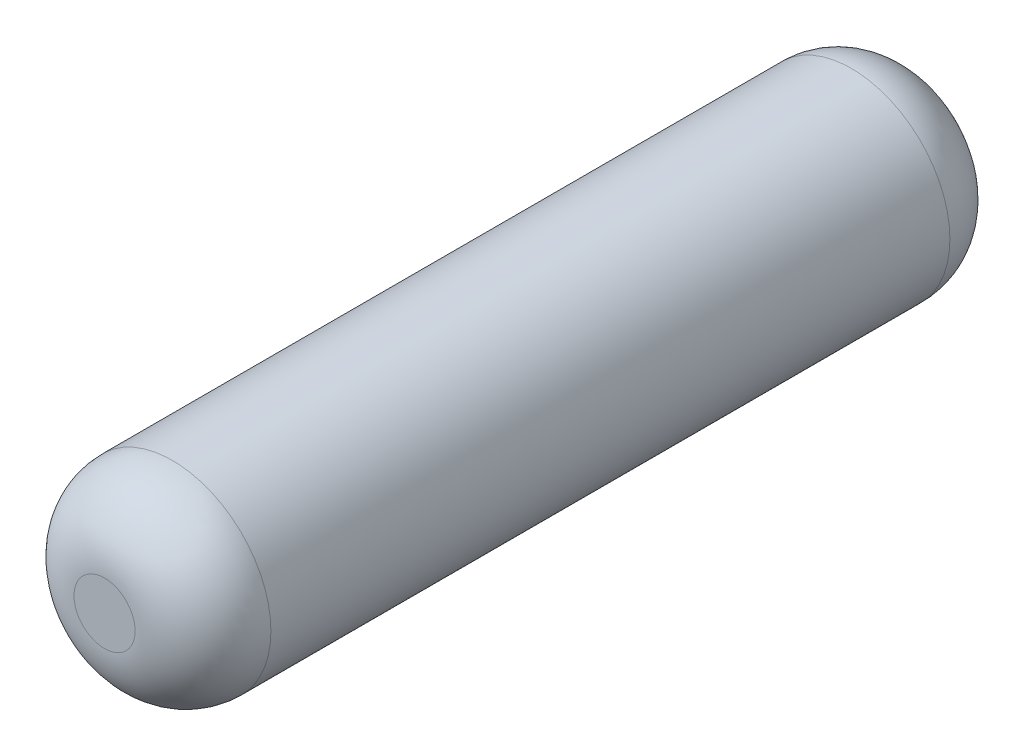
ISO-10303-21;
HEADER;
FILE_DESCRIPTION(('STEP AP214'),'2;1');
FILE_NAME('part.step','',(''),(''),'','','');
FILE_SCHEMA(('AUTOMOTIVE_DESIGN { 1 0 10303 214 1 1 1 1 }'));
ENDSEC;
DATA;
#1=APPLICATION_CONTEXT('core data for automotive mechanical design processes');
#2=APPLICATION_PROTOCOL_DEFINITION('international standard','automotive_design',2000,#1);
#3=PRODUCT_CONTEXT('',#1,'mechanical');
#4=PRODUCT('Part','Part','',(#3));
#5=PRODUCT_RELATED_PRODUCT_CATEGORY('part','',(#4));
#6=PRODUCT_DEFINITION_FORMATION('','',#4);
#7=PRODUCT_DEFINITION_CONTEXT('part definition',#1,'design');
#8=PRODUCT_DEFINITION('design','',#6,#7);
#9=PRODUCT_DEFINITION_SHAPE('','',#8);
#10=(LENGTH_UNIT() NAMED_UNIT(*) SI_UNIT(.MILLI.,.METRE.));
#11=(NAMED_UNIT(*) PLANE_ANGLE_UNIT() SI_UNIT($,.RADIAN.));
#12=(NAMED_UNIT(*) SI_UNIT($,.STERADIAN.) SOLID_ANGLE_UNIT());
#13=UNCERTAINTY_MEASURE_WITH_UNIT(LENGTH_MEASURE(1.E-05),#10,'distance_accuracy_value','');
#14=(GEOMETRIC_REPRESENTATION_CONTEXT(3) GLOBAL_UNCERTAINTY_ASSIGNED_CONTEXT((#13)) GLOBAL_UNIT_ASSIGNED_CONTEXT((#10,
#11,#12)) REPRESENTATION_CONTEXT('',''));
#15=CARTESIAN_POINT('',(0.,0.,0.));
#16=DIRECTION('',(0.,0.,1.));
#17=DIRECTION('',(1.,0.,0.));
#18=AXIS2_PLACEMENT_3D('',#15,#16,#17);
#19=CARTESIAN_POINT('',(0.,0.,-10.2));
#20=DIRECTION('',(0.,0.,1.));
#21=DIRECTION('',(1.,0.,0.));
#22=AXIS2_PLACEMENT_3D('',#19,#20,#21);
#23=CYLINDRICAL_SURFACE('',#22,1.015);
#24=CARTESIAN_POINT('',(0.,0.,-9.5));
#25=DIRECTION('',(0.,0.,1.));
#26=DIRECTION('',(1.,0.,0.));
#27=AXIS2_PLACEMENT_3D('',#24,#25,#26);
#28=CIRCLE('',#27,1.015);
#29=CARTESIAN_POINT('',(1.015,0.,-9.5));
#30=VERTEX_POINT('',#29);
#31=EDGE_CURVE('E49',#30,#30,#28,.T.);
#32=ORIENTED_EDGE('',*,*,#31,.T.);
#33=EDGE_LOOP('',(#32));
#34=FACE_BOUND('',#33,.T.);
#35=CARTESIAN_POINT('',(0.,0.,-2.5));
#36=DIRECTION('',(0.,0.,1.));
#37=DIRECTION('',(1.,0.,0.));
#38=AXIS2_PLACEMENT_3D('',#35,#36,#37);
#39=CIRCLE('',#38,1.015);
#40=CARTESIAN_POINT('',(1.015,0.,-2.5));
#41=VERTEX_POINT('',#40);
#42=EDGE_CURVE('E53',#41,#41,#39,.F.);
#43=ORIENTED_EDGE('',*,*,#42,.T.);
#44=EDGE_LOOP('',(#43));
#45=FACE_BOUND('',#44,.T.);
#46=ADVANCED_FACE('F38',(#34,#45),#23,.T.);
#47=CARTESIAN_POINT('',(0.,0.,-10.2));
#48=DIRECTION('',(0.,0.,1.));
#49=DIRECTION('',(1.,0.,0.));
#50=AXIS2_PLACEMENT_3D('',#47,#48,#49);
#51=PLANE('',#50);
#52=CARTESIAN_POINT('',(0.,0.,-10.2));
#53=DIRECTION('',(0.,0.,1.));
#54=DIRECTION('',(1.,0.,0.));
#55=AXIS2_PLACEMENT_3D('',#52,#53,#54);
#56=CIRCLE('',#55,0.315);
#57=CARTESIAN_POINT('',(0.315,0.,-10.2));
#58=VERTEX_POINT('',#57);
#59=EDGE_CURVE('E45',#58,#58,#56,.F.);
#60=ORIENTED_EDGE('',*,*,#59,.T.);
#61=EDGE_LOOP('',(#60));
#62=FACE_BOUND('',#61,.T.);
#63=ADVANCED_FACE('F69',(#62),#51,.F.);
#64=CARTESIAN_POINT('',(0.,0.,-1.8));
#65=DIRECTION('',(0.,0.,1.));
#66=DIRECTION('',(1.,0.,0.));
#67=AXIS2_PLACEMENT_3D('',#64,#65,#66);
#68=PLANE('',#67);
#69=CARTESIAN_POINT('',(0.,0.,-1.8));
#70=DIRECTION('',(0.,0.,1.));
#71=DIRECTION('',(1.,0.,0.));
#72=AXIS2_PLACEMENT_3D('',#69,#70,#71);
#73=CIRCLE('',#72,0.315);
#74=CARTESIAN_POINT('',(0.315,0.,-1.8));
#75=VERTEX_POINT('',#74);
#76=EDGE_CURVE('E10',#75,#75,#73,.T.);
#77=ORIENTED_EDGE('',*,*,#76,.T.);
#78=EDGE_LOOP('',(#77));
#79=FACE_BOUND('',#78,.T.);
#80=ADVANCED_FACE('F66',(#79),#68,.T.);
#81=CARTESIAN_POINT('',(0.,0.,-9.5));
#82=DIRECTION('',(0.,0.,1.));
#83=DIRECTION('',(1.,0.,0.));
#84=AXIS2_PLACEMENT_3D('',#81,#82,#83);
#85=DEGENERATE_TOROIDAL_SURFACE('',#84,0.315,0.7,.T.);
#86=ORIENTED_EDGE('',*,*,#59,.F.);
#87=EDGE_LOOP('',(#86));
#88=FACE_BOUND('',#87,.T.);
#89=ORIENTED_EDGE('',*,*,#31,.F.);
#90=EDGE_LOOP('',(#89));
#91=FACE_BOUND('',#90,.T.);
#92=ADVANCED_FACE('F62',(#88,#91),#85,.T.);
#93=CARTESIAN_POINT('',(0.,0.,-2.5));
#94=DIRECTION('',(0.,0.,1.));
#95=DIRECTION('',(1.,0.,0.));
#96=AXIS2_PLACEMENT_3D('',#93,#94,#95);
#97=DEGENERATE_TOROIDAL_SURFACE('',#96,0.315,0.7,.T.);
#98=ORIENTED_EDGE('',*,*,#42,.F.);
#99=EDGE_LOOP('',(#98));
#100=FACE_BOUND('',#99,.T.);
#101=ORIENTED_EDGE('',*,*,#76,.F.);
#102=EDGE_LOOP('',(#101));
#103=FACE_BOUND('',#102,.T.);
#104=ADVANCED_FACE('F40',(#100,#103),#97,.T.);
#105=CLOSED_SHELL('',(#46,#63,#80,#92,#104));
#106=MANIFOLD_SOLID_BREP('B2',#105);
#107=ADVANCED_BREP_SHAPE_REPRESENTATION('',(#18,#106),#14);
#108=SHAPE_DEFINITION_REPRESENTATION(#9,#107);
ENDSEC;
END-ISO-10303-21;
